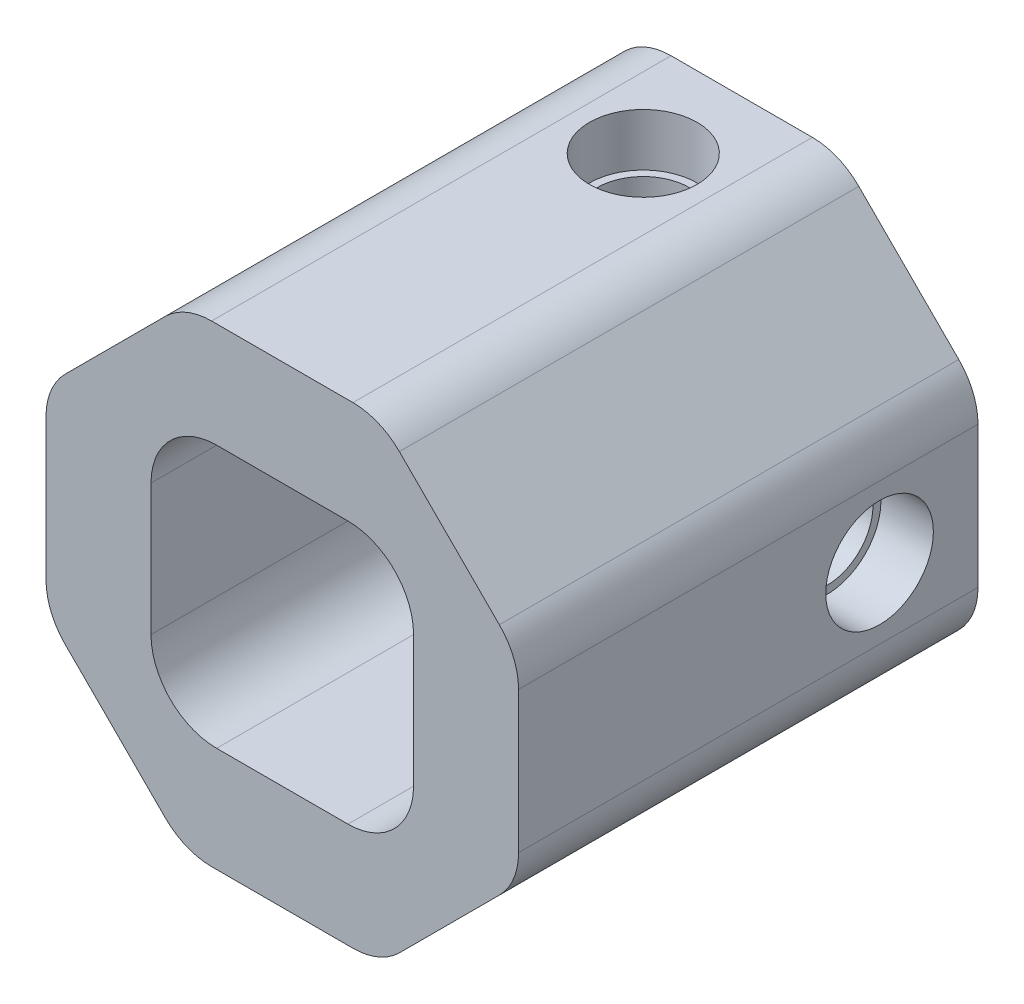
ISO-10303-21;
HEADER;
FILE_DESCRIPTION(('STEP AP214'),'2;1');
FILE_NAME('part.step','',(''),(''),'','','');
FILE_SCHEMA(('AUTOMOTIVE_DESIGN { 1 0 10303 214 1 1 1 1 }'));
ENDSEC;
DATA;
#1=APPLICATION_CONTEXT('core data for automotive mechanical design processes');
#2=APPLICATION_PROTOCOL_DEFINITION('international standard','automotive_design',2000,#1);
#3=PRODUCT_CONTEXT('',#1,'mechanical');
#4=PRODUCT('Part','Part','',(#3));
#5=PRODUCT_RELATED_PRODUCT_CATEGORY('part','',(#4));
#6=PRODUCT_DEFINITION_FORMATION('','',#4);
#7=PRODUCT_DEFINITION_CONTEXT('part definition',#1,'design');
#8=PRODUCT_DEFINITION('design','',#6,#7);
#9=PRODUCT_DEFINITION_SHAPE('','',#8);
#10=(LENGTH_UNIT() NAMED_UNIT(*) SI_UNIT(.MILLI.,.METRE.));
#11=(NAMED_UNIT(*) PLANE_ANGLE_UNIT() SI_UNIT($,.RADIAN.));
#12=(NAMED_UNIT(*) SI_UNIT($,.STERADIAN.) SOLID_ANGLE_UNIT());
#13=UNCERTAINTY_MEASURE_WITH_UNIT(LENGTH_MEASURE(1.E-05),#10,'distance_accuracy_value','');
#14=(GEOMETRIC_REPRESENTATION_CONTEXT(3) GLOBAL_UNCERTAINTY_ASSIGNED_CONTEXT((#13)) GLOBAL_UNIT_ASSIGNED_CONTEXT((#10,
#11,#12)) REPRESENTATION_CONTEXT('',''));
#15=CARTESIAN_POINT('',(0.,0.,0.));
#16=DIRECTION('',(0.,0.,1.));
#17=DIRECTION('',(1.,0.,0.));
#18=AXIS2_PLACEMENT_3D('',#15,#16,#17);
#19=CARTESIAN_POINT('',(-7.45584412271571,18.,7.5));
#20=DIRECTION('',(0.707106781186548,-0.707106781186547,0.));
#21=DIRECTION('',(0.707106781186547,0.707106781186548,0.));
#22=AXIS2_PLACEMENT_3D('',#19,#20,#21);
#23=PLANE('',#22);
#24=DIRECTION('',(-0.707106781186547,-0.707106781186548,0.));
#25=VECTOR('',#24,1.);
#26=CARTESIAN_POINT('',(-7.45584412271571,18.,-7.5));
#27=LINE('',#26,#25);
#28=CARTESIAN_POINT('',(-8.92031021678297,16.5355339059327,-7.5));
#29=VERTEX_POINT('',#28);
#30=CARTESIAN_POINT('',(-16.5355339059327,8.92031021678298,-7.5));
#31=VERTEX_POINT('',#30);
#32=EDGE_CURVE('E316',#29,#31,#27,.T.);
#33=ORIENTED_EDGE('',*,*,#32,.T.);
#34=DIRECTION('',(0.,0.,-1.));
#35=VECTOR('',#34,1.);
#36=CARTESIAN_POINT('',(-16.5355339059327,8.92031021678298,7.5));
#37=LINE('',#36,#35);
#38=CARTESIAN_POINT('',(-16.5355339059327,8.92031021678298,27.5));
#39=VERTEX_POINT('',#38);
#40=EDGE_CURVE('E11',#31,#39,#37,.F.);
#41=ORIENTED_EDGE('',*,*,#40,.T.);
#42=DIRECTION('',(-0.707106781186547,-0.707106781186548,0.));
#43=VECTOR('',#42,1.);
#44=CARTESIAN_POINT('',(-8.92031021678297,16.5355339059327,27.5));
#45=LINE('',#44,#43);
#46=CARTESIAN_POINT('',(-8.92031021678297,16.5355339059327,27.5));
#47=VERTEX_POINT('',#46);
#48=EDGE_CURVE('E273',#47,#39,#45,.T.);
#49=ORIENTED_EDGE('',*,*,#48,.F.);
#50=DIRECTION('',(0.,0.,-1.));
#51=VECTOR('',#50,1.);
#52=CARTESIAN_POINT('',(-8.92031021678297,16.5355339059327,7.5));
#53=LINE('',#52,#51);
#54=EDGE_CURVE('E47',#47,#29,#53,.T.);
#55=ORIENTED_EDGE('',*,*,#54,.T.);
#56=EDGE_LOOP('',(#33,#41,#49,#55));
#57=FACE_BOUND('',#56,.T.);
#58=ADVANCED_FACE('F39',(#57),#23,.F.);
#59=CARTESIAN_POINT('',(-18.,7.45584412271571,7.5));
#60=DIRECTION('',(1.,0.,0.));
#61=DIRECTION('',(0.,0.,-1.));
#62=AXIS2_PLACEMENT_3D('',#59,#60,#61);
#63=PLANE('',#62);
#64=CARTESIAN_POINT('',(-18.,0.,0.));
#65=DIRECTION('',(1.,0.,0.));
#66=DIRECTION('',(0.,0.,-1.));
#67=AXIS2_PLACEMENT_3D('',#64,#65,#66);
#68=CIRCLE('',#67,4.1);
#69=CARTESIAN_POINT('',(-18.,0.,-4.1));
#70=VERTEX_POINT('',#69);
#71=EDGE_CURVE('E294',#70,#70,#68,.T.);
#72=ORIENTED_EDGE('',*,*,#71,.T.);
#73=EDGE_LOOP('',(#72));
#74=FACE_BOUND('',#73,.T.);
#75=DIRECTION('',(0.,-1.,0.));
#76=VECTOR('',#75,1.);
#77=CARTESIAN_POINT('',(-18.,7.45584412271571,-7.5));
#78=LINE('',#77,#76);
#79=CARTESIAN_POINT('',(-18.,5.38477631085024,-7.5));
#80=VERTEX_POINT('',#79);
#81=CARTESIAN_POINT('',(-18.,-5.38477631085024,-7.5));
#82=VERTEX_POINT('',#81);
#83=EDGE_CURVE('E319',#80,#82,#78,.T.);
#84=ORIENTED_EDGE('',*,*,#83,.T.);
#85=DIRECTION('',(0.,0.,-1.));
#86=VECTOR('',#85,1.);
#87=CARTESIAN_POINT('',(-18.,-5.38477631085024,7.5));
#88=LINE('',#87,#86);
#89=CARTESIAN_POINT('',(-18.,-5.38477631085024,27.5));
#90=VERTEX_POINT('',#89);
#91=EDGE_CURVE('E394',#82,#90,#88,.F.);
#92=ORIENTED_EDGE('',*,*,#91,.T.);
#93=DIRECTION('',(0.,-1.,0.));
#94=VECTOR('',#93,1.);
#95=CARTESIAN_POINT('',(-18.,5.38477631085024,27.5));
#96=LINE('',#95,#94);
#97=CARTESIAN_POINT('',(-18.,5.38477631085024,27.5));
#98=VERTEX_POINT('',#97);
#99=EDGE_CURVE('E279',#98,#90,#96,.T.);
#100=ORIENTED_EDGE('',*,*,#99,.F.);
#101=DIRECTION('',(0.,0.,-1.));
#102=VECTOR('',#101,1.);
#103=CARTESIAN_POINT('',(-18.,5.38477631085024,7.5));
#104=LINE('',#103,#102);
#105=EDGE_CURVE('E392',#98,#80,#104,.T.);
#106=ORIENTED_EDGE('',*,*,#105,.T.);
#107=EDGE_LOOP('',(#84,#92,#100,#106));
#108=FACE_BOUND('',#107,.T.);
#109=ADVANCED_FACE('F416',(#74,#108),#63,.F.);
#110=CARTESIAN_POINT('',(-18.,-7.45584412271571,7.5));
#111=DIRECTION('',(0.707106781186548,0.707106781186547,0.));
#112=DIRECTION('',(-0.707106781186547,0.707106781186548,0.));
#113=AXIS2_PLACEMENT_3D('',#110,#111,#112);
#114=PLANE('',#113);
#115=DIRECTION('',(0.707106781186547,-0.707106781186548,0.));
#116=VECTOR('',#115,1.);
#117=CARTESIAN_POINT('',(-18.,-7.45584412271571,-7.5));
#118=LINE('',#117,#116);
#119=CARTESIAN_POINT('',(-16.5355339059327,-8.92031021678297,-7.5));
#120=VERTEX_POINT('',#119);
#121=CARTESIAN_POINT('',(-8.92031021678298,-16.5355339059327,-7.5));
#122=VERTEX_POINT('',#121);
#123=EDGE_CURVE('E321',#120,#122,#118,.T.);
#124=ORIENTED_EDGE('',*,*,#123,.T.);
#125=DIRECTION('',(0.,0.,-1.));
#126=VECTOR('',#125,1.);
#127=CARTESIAN_POINT('',(-8.92031021678298,-16.5355339059327,7.5));
#128=LINE('',#127,#126);
#129=CARTESIAN_POINT('',(-8.92031021678298,-16.5355339059327,27.5));
#130=VERTEX_POINT('',#129);
#131=EDGE_CURVE('E390',#122,#130,#128,.F.);
#132=ORIENTED_EDGE('',*,*,#131,.T.);
#133=DIRECTION('',(0.707106781186547,-0.707106781186548,0.));
#134=VECTOR('',#133,1.);
#135=CARTESIAN_POINT('',(-16.5355339059327,-8.92031021678297,27.5));
#136=LINE('',#135,#134);
#137=CARTESIAN_POINT('',(-16.5355339059327,-8.92031021678297,27.5));
#138=VERTEX_POINT('',#137);
#139=EDGE_CURVE('E285',#138,#130,#136,.T.);
#140=ORIENTED_EDGE('',*,*,#139,.F.);
#141=DIRECTION('',(0.,0.,-1.));
#142=VECTOR('',#141,1.);
#143=CARTESIAN_POINT('',(-16.5355339059327,-8.92031021678297,7.5));
#144=LINE('',#143,#142);
#145=EDGE_CURVE('E387',#138,#120,#144,.T.);
#146=ORIENTED_EDGE('',*,*,#145,.T.);
#147=EDGE_LOOP('',(#124,#132,#140,#146));
#148=FACE_BOUND('',#147,.T.);
#149=ADVANCED_FACE('F425',(#148),#114,.F.);
#150=CARTESIAN_POINT('',(-7.45584412271572,-18.,7.5));
#151=DIRECTION('',(0.,1.,0.));
#152=DIRECTION('',(-1.,0.,0.));
#153=AXIS2_PLACEMENT_3D('',#150,#151,#152);
#154=PLANE('',#153);
#155=CARTESIAN_POINT('',(0.,-18.,0.));
#156=DIRECTION('',(0.,1.,0.));
#157=DIRECTION('',(-1.,0.,0.));
#158=AXIS2_PLACEMENT_3D('',#155,#156,#157);
#159=CIRCLE('',#158,4.1);
#160=CARTESIAN_POINT('',(-4.1,-18.,0.));
#161=VERTEX_POINT('',#160);
#162=EDGE_CURVE('E303',#161,#161,#159,.T.);
#163=ORIENTED_EDGE('',*,*,#162,.T.);
#164=EDGE_LOOP('',(#163));
#165=FACE_BOUND('',#164,.T.);
#166=DIRECTION('',(1.,0.,0.));
#167=VECTOR('',#166,1.);
#168=CARTESIAN_POINT('',(-7.45584412271572,-18.,-7.5));
#169=LINE('',#168,#167);
#170=CARTESIAN_POINT('',(-5.38477631085024,-18.,-7.5));
#171=VERTEX_POINT('',#170);
#172=CARTESIAN_POINT('',(5.38477631085023,-18.,-7.5));
#173=VERTEX_POINT('',#172);
#174=EDGE_CURVE('E324',#171,#173,#169,.T.);
#175=ORIENTED_EDGE('',*,*,#174,.T.);
#176=DIRECTION('',(0.,0.,-1.));
#177=VECTOR('',#176,1.);
#178=CARTESIAN_POINT('',(5.38477631085023,-18.,7.5));
#179=LINE('',#178,#177);
#180=CARTESIAN_POINT('',(5.38477631085023,-18.,27.5));
#181=VERTEX_POINT('',#180);
#182=EDGE_CURVE('E385',#173,#181,#179,.F.);
#183=ORIENTED_EDGE('',*,*,#182,.T.);
#184=DIRECTION('',(1.,0.,0.));
#185=VECTOR('',#184,1.);
#186=CARTESIAN_POINT('',(-5.38477631085024,-18.,27.5));
#187=LINE('',#186,#185);
#188=CARTESIAN_POINT('',(-5.38477631085024,-18.,27.5));
#189=VERTEX_POINT('',#188);
#190=EDGE_CURVE('E291',#189,#181,#187,.T.);
#191=ORIENTED_EDGE('',*,*,#190,.F.);
#192=DIRECTION('',(0.,0.,-1.));
#193=VECTOR('',#192,1.);
#194=CARTESIAN_POINT('',(-5.38477631085024,-18.,7.5));
#195=LINE('',#194,#193);
#196=EDGE_CURVE('E382',#189,#171,#195,.T.);
#197=ORIENTED_EDGE('',*,*,#196,.T.);
#198=EDGE_LOOP('',(#175,#183,#191,#197));
#199=FACE_BOUND('',#198,.T.);
#200=ADVANCED_FACE('F432',(#165,#199),#154,.F.);
#201=CARTESIAN_POINT('',(7.45584412271571,-18.,7.5));
#202=DIRECTION('',(-0.707106781186547,0.707106781186548,0.));
#203=DIRECTION('',(-0.707106781186548,-0.707106781186547,0.));
#204=AXIS2_PLACEMENT_3D('',#201,#202,#203);
#205=PLANE('',#204);
#206=DIRECTION('',(0.707106781186548,0.707106781186547,0.));
#207=VECTOR('',#206,1.);
#208=CARTESIAN_POINT('',(7.45584412271571,-18.,-7.5));
#209=LINE('',#208,#207);
#210=CARTESIAN_POINT('',(8.92031021678297,-16.5355339059327,-7.5));
#211=VERTEX_POINT('',#210);
#212=CARTESIAN_POINT('',(16.5355339059327,-8.92031021678298,-7.5));
#213=VERTEX_POINT('',#212);
#214=EDGE_CURVE('E327',#211,#213,#209,.T.);
#215=ORIENTED_EDGE('',*,*,#214,.T.);
#216=DIRECTION('',(0.,0.,-1.));
#217=VECTOR('',#216,1.);
#218=CARTESIAN_POINT('',(16.5355339059327,-8.92031021678298,7.5));
#219=LINE('',#218,#217);
#220=CARTESIAN_POINT('',(16.5355339059327,-8.92031021678298,27.5));
#221=VERTEX_POINT('',#220);
#222=EDGE_CURVE('E380',#213,#221,#219,.F.);
#223=ORIENTED_EDGE('',*,*,#222,.T.);
#224=DIRECTION('',(0.707106781186548,0.707106781186547,0.));
#225=VECTOR('',#224,1.);
#226=CARTESIAN_POINT('',(8.92031021678297,-16.5355339059327,27.5));
#227=LINE('',#226,#225);
#228=CARTESIAN_POINT('',(8.92031021678297,-16.5355339059327,27.5));
#229=VERTEX_POINT('',#228);
#230=EDGE_CURVE('E249',#229,#221,#227,.T.);
#231=ORIENTED_EDGE('',*,*,#230,.F.);
#232=DIRECTION('',(0.,0.,-1.));
#233=VECTOR('',#232,1.);
#234=CARTESIAN_POINT('',(8.92031021678297,-16.5355339059327,7.5));
#235=LINE('',#234,#233);
#236=EDGE_CURVE('E377',#229,#211,#235,.T.);
#237=ORIENTED_EDGE('',*,*,#236,.T.);
#238=EDGE_LOOP('',(#215,#223,#231,#237));
#239=FACE_BOUND('',#238,.T.);
#240=ADVANCED_FACE('F833',(#239),#205,.F.);
#241=CARTESIAN_POINT('',(18.,-7.45584412271571,7.5));
#242=DIRECTION('',(-1.,0.,0.));
#243=DIRECTION('',(0.,-1.,0.));
#244=AXIS2_PLACEMENT_3D('',#241,#242,#243);
#245=PLANE('',#244);
#246=CARTESIAN_POINT('',(18.,0.,0.));
#247=DIRECTION('',(-1.,0.,0.));
#248=DIRECTION('',(0.,-1.,0.));
#249=AXIS2_PLACEMENT_3D('',#246,#247,#248);
#250=CIRCLE('',#249,4.1);
#251=CARTESIAN_POINT('',(18.,-4.1,0.));
#252=VERTEX_POINT('',#251);
#253=EDGE_CURVE('E297',#252,#252,#250,.T.);
#254=ORIENTED_EDGE('',*,*,#253,.T.);
#255=EDGE_LOOP('',(#254));
#256=FACE_BOUND('',#255,.T.);
#257=DIRECTION('',(0.,0.,-1.));
#258=VECTOR('',#257,1.);
#259=CARTESIAN_POINT('',(18.,5.38477631085023,7.5));
#260=LINE('',#259,#258);
#261=CARTESIAN_POINT('',(18.,5.38477631085023,-7.5));
#262=VERTEX_POINT('',#261);
#263=CARTESIAN_POINT('',(18.,5.38477631085023,27.5));
#264=VERTEX_POINT('',#263);
#265=EDGE_CURVE('E358',#262,#264,#260,.F.);
#266=ORIENTED_EDGE('',*,*,#265,.T.);
#267=DIRECTION('',(0.,1.,0.));
#268=VECTOR('',#267,1.);
#269=CARTESIAN_POINT('',(18.,-5.38477631085024,27.5));
#270=LINE('',#269,#268);
#271=CARTESIAN_POINT('',(18.,-5.38477631085024,27.5));
#272=VERTEX_POINT('',#271);
#273=EDGE_CURVE('E255',#272,#264,#270,.T.);
#274=ORIENTED_EDGE('',*,*,#273,.F.);
#275=DIRECTION('',(0.,0.,-1.));
#276=VECTOR('',#275,1.);
#277=CARTESIAN_POINT('',(18.,-5.38477631085024,7.5));
#278=LINE('',#277,#276);
#279=CARTESIAN_POINT('',(18.,-5.38477631085024,-7.5));
#280=VERTEX_POINT('',#279);
#281=EDGE_CURVE('E360',#272,#280,#278,.T.);
#282=ORIENTED_EDGE('',*,*,#281,.T.);
#283=DIRECTION('',(0.,1.,0.));
#284=VECTOR('',#283,1.);
#285=CARTESIAN_POINT('',(18.,-7.45584412271571,-7.5));
#286=LINE('',#285,#284);
#287=EDGE_CURVE('E330',#280,#262,#286,.T.);
#288=ORIENTED_EDGE('',*,*,#287,.T.);
#289=EDGE_LOOP('',(#266,#274,#282,#288));
#290=FACE_BOUND('',#289,.T.);
#291=ADVANCED_FACE('F445',(#256,#290),#245,.F.);
#292=CARTESIAN_POINT('',(18.,7.45584412271571,7.5));
#293=DIRECTION('',(-0.707106781186548,-0.707106781186547,0.));
#294=DIRECTION('',(0.707106781186547,-0.707106781186548,0.));
#295=AXIS2_PLACEMENT_3D('',#292,#293,#294);
#296=PLANE('',#295);
#297=DIRECTION('',(0.,0.,-1.));
#298=VECTOR('',#297,1.);
#299=CARTESIAN_POINT('',(8.92031021678298,16.5355339059327,7.5));
#300=LINE('',#299,#298);
#301=CARTESIAN_POINT('',(8.92031021678298,16.5355339059327,-7.5));
#302=VERTEX_POINT('',#301);
#303=CARTESIAN_POINT('',(8.92031021678298,16.5355339059327,27.5));
#304=VERTEX_POINT('',#303);
#305=EDGE_CURVE('E396',#302,#304,#300,.F.);
#306=ORIENTED_EDGE('',*,*,#305,.T.);
#307=DIRECTION('',(-0.707106781186547,0.707106781186548,0.));
#308=VECTOR('',#307,1.);
#309=CARTESIAN_POINT('',(16.5355339059327,8.92031021678297,27.5));
#310=LINE('',#309,#308);
#311=CARTESIAN_POINT('',(16.5355339059327,8.92031021678297,27.5));
#312=VERTEX_POINT('',#311);
#313=EDGE_CURVE('E261',#312,#304,#310,.T.);
#314=ORIENTED_EDGE('',*,*,#313,.F.);
#315=DIRECTION('',(0.,0.,-1.));
#316=VECTOR('',#315,1.);
#317=CARTESIAN_POINT('',(16.5355339059327,8.92031021678297,7.5));
#318=LINE('',#317,#316);
#319=CARTESIAN_POINT('',(16.5355339059327,8.92031021678297,-7.5));
#320=VERTEX_POINT('',#319);
#321=EDGE_CURVE('E398',#312,#320,#318,.T.);
#322=ORIENTED_EDGE('',*,*,#321,.T.);
#323=DIRECTION('',(-0.707106781186547,0.707106781186548,0.));
#324=VECTOR('',#323,1.);
#325=CARTESIAN_POINT('',(18.,7.45584412271571,-7.5));
#326=LINE('',#325,#324);
#327=EDGE_CURVE('E333',#320,#302,#326,.T.);
#328=ORIENTED_EDGE('',*,*,#327,.T.);
#329=EDGE_LOOP('',(#306,#314,#322,#328));
#330=FACE_BOUND('',#329,.T.);
#331=ADVANCED_FACE('F454',(#330),#296,.F.);
#332=CARTESIAN_POINT('',(7.45584412271571,18.,7.5));
#333=DIRECTION('',(0.,-1.,0.));
#334=DIRECTION('',(1.,0.,0.));
#335=AXIS2_PLACEMENT_3D('',#332,#333,#334);
#336=PLANE('',#335);
#337=CARTESIAN_POINT('',(0.,18.,0.));
#338=DIRECTION('',(0.,-1.,0.));
#339=DIRECTION('',(0.,0.,-1.));
#340=AXIS2_PLACEMENT_3D('',#337,#338,#339);
#341=CIRCLE('',#340,4.1);
#342=CARTESIAN_POINT('',(0.,18.,-4.1));
#343=VERTEX_POINT('',#342);
#344=EDGE_CURVE('E300',#343,#343,#341,.T.);
#345=ORIENTED_EDGE('',*,*,#344,.T.);
#346=EDGE_LOOP('',(#345));
#347=FACE_BOUND('',#346,.T.);
#348=DIRECTION('',(0.,0.,-1.));
#349=VECTOR('',#348,1.);
#350=CARTESIAN_POINT('',(-5.38477631085023,18.,7.5));
#351=LINE('',#350,#349);
#352=CARTESIAN_POINT('',(-5.38477631085023,18.,-7.5));
#353=VERTEX_POINT('',#352);
#354=CARTESIAN_POINT('',(-5.38477631085023,18.,27.5));
#355=VERTEX_POINT('',#354);
#356=EDGE_CURVE('E401',#353,#355,#351,.F.);
#357=ORIENTED_EDGE('',*,*,#356,.T.);
#358=DIRECTION('',(-1.,0.,0.));
#359=VECTOR('',#358,1.);
#360=CARTESIAN_POINT('',(5.38477631085024,18.,27.5));
#361=LINE('',#360,#359);
#362=CARTESIAN_POINT('',(5.38477631085024,18.,27.5));
#363=VERTEX_POINT('',#362);
#364=EDGE_CURVE('E267',#363,#355,#361,.T.);
#365=ORIENTED_EDGE('',*,*,#364,.F.);
#366=DIRECTION('',(0.,0.,-1.));
#367=VECTOR('',#366,1.);
#368=CARTESIAN_POINT('',(5.38477631085024,18.,7.5));
#369=LINE('',#368,#367);
#370=CARTESIAN_POINT('',(5.38477631085024,18.,-7.5));
#371=VERTEX_POINT('',#370);
#372=EDGE_CURVE('E403',#363,#371,#369,.T.);
#373=ORIENTED_EDGE('',*,*,#372,.T.);
#374=DIRECTION('',(-1.,0.,0.));
#375=VECTOR('',#374,1.);
#376=CARTESIAN_POINT('',(7.45584412271571,18.,-7.5));
#377=LINE('',#376,#375);
#378=EDGE_CURVE('E336',#371,#353,#377,.T.);
#379=ORIENTED_EDGE('',*,*,#378,.T.);
#380=EDGE_LOOP('',(#357,#365,#373,#379));
#381=FACE_BOUND('',#380,.T.);
#382=ADVANCED_FACE('F461',(#347,#381),#336,.F.);
#383=CARTESIAN_POINT('',(0.,0.,-7.5));
#384=DIRECTION('',(0.,0.,1.));
#385=DIRECTION('',(1.,0.,0.));
#386=AXIS2_PLACEMENT_3D('',#383,#384,#385);
#387=PLANE('',#386);
#388=DIRECTION('',(0.,1.,0.));
#389=VECTOR('',#388,1.);
#390=CARTESIAN_POINT('',(10.,-10.,-7.5));
#391=LINE('',#390,#389);
#392=CARTESIAN_POINT('',(10.,-5.,-7.5));
#393=VERTEX_POINT('',#392);
#394=CARTESIAN_POINT('',(10.,5.,-7.5));
#395=VERTEX_POINT('',#394);
#396=EDGE_CURVE('E310',#393,#395,#391,.T.);
#397=ORIENTED_EDGE('',*,*,#396,.T.);
#398=CARTESIAN_POINT('',(5.,5.,-7.5));
#399=DIRECTION('',(0.,0.,1.));
#400=DIRECTION('',(1.,0.,0.));
#401=AXIS2_PLACEMENT_3D('',#398,#399,#400);
#402=CIRCLE('',#401,5.);
#403=CARTESIAN_POINT('',(5.,10.,-7.5));
#404=VERTEX_POINT('',#403);
#405=EDGE_CURVE('E354',#395,#404,#402,.T.);
#406=ORIENTED_EDGE('',*,*,#405,.T.);
#407=DIRECTION('',(-1.,0.,0.));
#408=VECTOR('',#407,1.);
#409=CARTESIAN_POINT('',(10.,10.,-7.5));
#410=LINE('',#409,#408);
#411=CARTESIAN_POINT('',(-5.,10.,-7.5));
#412=VERTEX_POINT('',#411);
#413=EDGE_CURVE('E313',#404,#412,#410,.T.);
#414=ORIENTED_EDGE('',*,*,#413,.T.);
#415=CARTESIAN_POINT('',(-5.,5.,-7.5));
#416=DIRECTION('',(0.,0.,1.));
#417=DIRECTION('',(1.,0.,0.));
#418=AXIS2_PLACEMENT_3D('',#415,#416,#417);
#419=CIRCLE('',#418,5.);
#420=CARTESIAN_POINT('',(-10.,5.,-7.5));
#421=VERTEX_POINT('',#420);
#422=EDGE_CURVE('E356',#412,#421,#419,.T.);
#423=ORIENTED_EDGE('',*,*,#422,.T.);
#424=DIRECTION('',(0.,-1.,0.));
#425=VECTOR('',#424,1.);
#426=CARTESIAN_POINT('',(-10.,-10.,-7.5));
#427=LINE('',#426,#425);
#428=CARTESIAN_POINT('',(-10.,-5.,-7.5));
#429=VERTEX_POINT('',#428);
#430=EDGE_CURVE('E209',#421,#429,#427,.T.);
#431=ORIENTED_EDGE('',*,*,#430,.T.);
#432=CARTESIAN_POINT('',(-5.,-5.,-7.5));
#433=DIRECTION('',(0.,0.,1.));
#434=DIRECTION('',(1.,0.,0.));
#435=AXIS2_PLACEMENT_3D('',#432,#433,#434);
#436=CIRCLE('',#435,5.);
#437=CARTESIAN_POINT('',(-5.,-10.,-7.5));
#438=VERTEX_POINT('',#437);
#439=EDGE_CURVE('E352',#429,#438,#436,.T.);
#440=ORIENTED_EDGE('',*,*,#439,.T.);
#441=DIRECTION('',(1.,0.,0.));
#442=VECTOR('',#441,1.);
#443=CARTESIAN_POINT('',(10.,-10.,-7.5));
#444=LINE('',#443,#442);
#445=CARTESIAN_POINT('',(5.,-10.,-7.5));
#446=VERTEX_POINT('',#445);
#447=EDGE_CURVE('E307',#438,#446,#444,.T.);
#448=ORIENTED_EDGE('',*,*,#447,.T.);
#449=CARTESIAN_POINT('',(5.,-5.,-7.5));
#450=DIRECTION('',(0.,0.,1.));
#451=DIRECTION('',(1.,0.,0.));
#452=AXIS2_PLACEMENT_3D('',#449,#450,#451);
#453=CIRCLE('',#452,5.);
#454=EDGE_CURVE('E350',#446,#393,#453,.T.);
#455=ORIENTED_EDGE('',*,*,#454,.T.);
#456=EDGE_LOOP('',(#397,#406,#414,#423,#431,#440,#448,#455));
#457=FACE_BOUND('',#456,.T.);
#458=ORIENTED_EDGE('',*,*,#287,.F.);
#459=CARTESIAN_POINT('',(13.,-5.38477631085024,-7.5));
#460=DIRECTION('',(0.,0.,1.));
#461=DIRECTION('',(1.,0.,0.));
#462=AXIS2_PLACEMENT_3D('',#459,#460,#461);
#463=CIRCLE('',#462,5.);
#464=EDGE_CURVE('E375',#280,#213,#463,.F.);
#465=ORIENTED_EDGE('',*,*,#464,.T.);
#466=ORIENTED_EDGE('',*,*,#214,.F.);
#467=CARTESIAN_POINT('',(5.38477631085023,-13.,-7.5));
#468=DIRECTION('',(0.,0.,1.));
#469=DIRECTION('',(1.,0.,0.));
#470=AXIS2_PLACEMENT_3D('',#467,#468,#469);
#471=CIRCLE('',#470,5.);
#472=EDGE_CURVE('E373',#211,#173,#471,.F.);
#473=ORIENTED_EDGE('',*,*,#472,.T.);
#474=ORIENTED_EDGE('',*,*,#174,.F.);
#475=CARTESIAN_POINT('',(-5.38477631085024,-13.,-7.5));
#476=DIRECTION('',(0.,0.,1.));
#477=DIRECTION('',(1.,0.,0.));
#478=AXIS2_PLACEMENT_3D('',#475,#476,#477);
#479=CIRCLE('',#478,5.);
#480=EDGE_CURVE('E371',#171,#122,#479,.F.);
#481=ORIENTED_EDGE('',*,*,#480,.T.);
#482=ORIENTED_EDGE('',*,*,#123,.F.);
#483=CARTESIAN_POINT('',(-13.,-5.38477631085024,-7.5));
#484=DIRECTION('',(0.,0.,1.));
#485=DIRECTION('',(1.,0.,0.));
#486=AXIS2_PLACEMENT_3D('',#483,#484,#485);
#487=CIRCLE('',#486,5.);
#488=EDGE_CURVE('E54',#120,#82,#487,.F.);
#489=ORIENTED_EDGE('',*,*,#488,.T.);
#490=ORIENTED_EDGE('',*,*,#83,.F.);
#491=CARTESIAN_POINT('',(-13.,5.38477631085024,-7.5));
#492=DIRECTION('',(0.,0.,1.));
#493=DIRECTION('',(1.,0.,0.));
#494=AXIS2_PLACEMENT_3D('',#491,#492,#493);
#495=CIRCLE('',#494,5.);
#496=EDGE_CURVE('E62',#80,#31,#495,.F.);
#497=ORIENTED_EDGE('',*,*,#496,.T.);
#498=ORIENTED_EDGE('',*,*,#32,.F.);
#499=CARTESIAN_POINT('',(-5.38477631085023,13.,-7.5));
#500=DIRECTION('',(0.,0.,1.));
#501=DIRECTION('',(1.,0.,0.));
#502=AXIS2_PLACEMENT_3D('',#499,#500,#501);
#503=CIRCLE('',#502,5.);
#504=EDGE_CURVE('E363',#29,#353,#503,.F.);
#505=ORIENTED_EDGE('',*,*,#504,.T.);
#506=ORIENTED_EDGE('',*,*,#378,.F.);
#507=CARTESIAN_POINT('',(5.38477631085024,13.,-7.5));
#508=DIRECTION('',(0.,0.,1.));
#509=DIRECTION('',(1.,0.,0.));
#510=AXIS2_PLACEMENT_3D('',#507,#508,#509);
#511=CIRCLE('',#510,5.);
#512=EDGE_CURVE('E366',#371,#302,#511,.F.);
#513=ORIENTED_EDGE('',*,*,#512,.T.);
#514=ORIENTED_EDGE('',*,*,#327,.F.);
#515=CARTESIAN_POINT('',(13.,5.38477631085023,-7.5));
#516=DIRECTION('',(0.,0.,1.));
#517=DIRECTION('',(1.,0.,0.));
#518=AXIS2_PLACEMENT_3D('',#515,#516,#517);
#519=CIRCLE('',#518,5.);
#520=EDGE_CURVE('E368',#320,#262,#519,.F.);
#521=ORIENTED_EDGE('',*,*,#520,.T.);
#522=EDGE_LOOP('',(#458,#465,#466,#473,#474,#481,#482,#489,#490,#497,#498,#505,#506,#513,#514,#521));
#523=FACE_BOUND('',#522,.T.);
#524=ADVANCED_FACE('F412',(#457,#523),#387,.F.);
#525=CARTESIAN_POINT('',(-10.,-10.,-7.5));
#526=DIRECTION('',(-1.,0.,0.));
#527=DIRECTION('',(0.,0.,1.));
#528=AXIS2_PLACEMENT_3D('',#525,#526,#527);
#529=PLANE('',#528);
#530=DIRECTION('',(0.,0.,1.));
#531=VECTOR('',#530,1.);
#532=CARTESIAN_POINT('',(-10.,5.,7.5));
#533=LINE('',#532,#531);
#534=CARTESIAN_POINT('',(-10.,5.,27.5));
#535=VERTEX_POINT('',#534);
#536=EDGE_CURVE('E201',#421,#535,#533,.T.);
#537=ORIENTED_EDGE('',*,*,#536,.T.);
#538=DIRECTION('',(0.,-1.,0.));
#539=VECTOR('',#538,1.);
#540=CARTESIAN_POINT('',(-10.,5.,27.5));
#541=LINE('',#540,#539);
#542=CARTESIAN_POINT('',(-10.,-5.,27.5));
#543=VERTEX_POINT('',#542);
#544=EDGE_CURVE('E206',#535,#543,#541,.T.);
#545=ORIENTED_EDGE('',*,*,#544,.T.);
#546=DIRECTION('',(0.,0.,1.));
#547=VECTOR('',#546,1.);
#548=CARTESIAN_POINT('',(-10.,-5.,-7.5));
#549=LINE('',#548,#547);
#550=EDGE_CURVE('E212',#543,#429,#549,.F.);
#551=ORIENTED_EDGE('',*,*,#550,.T.);
#552=ORIENTED_EDGE('',*,*,#430,.F.);
#553=EDGE_LOOP('',(#537,#545,#551,#552));
#554=FACE_BOUND('',#553,.T.);
#555=CARTESIAN_POINT('',(-10.,0.,0.));
#556=DIRECTION('',(-1.,0.,0.));
#557=DIRECTION('',(0.,0.,1.));
#558=AXIS2_PLACEMENT_3D('',#555,#556,#557);
#559=CIRCLE('',#558,3.5);
#560=CARTESIAN_POINT('',(-10.,0.,3.5));
#561=VERTEX_POINT('',#560);
#562=EDGE_CURVE('E1019',#561,#561,#559,.F.);
#563=ORIENTED_EDGE('',*,*,#562,.F.);
#564=EDGE_LOOP('',(#563));
#565=FACE_BOUND('',#564,.T.);
#566=ADVANCED_FACE('F203',(#554,#565),#529,.F.);
#567=CARTESIAN_POINT('',(10.,10.,-7.5));
#568=DIRECTION('',(0.,1.,0.));
#569=DIRECTION('',(0.,0.,1.));
#570=AXIS2_PLACEMENT_3D('',#567,#568,#569);
#571=PLANE('',#570);
#572=ORIENTED_EDGE('',*,*,#413,.F.);
#573=DIRECTION('',(0.,0.,1.));
#574=VECTOR('',#573,1.);
#575=CARTESIAN_POINT('',(5.,10.,7.5));
#576=LINE('',#575,#574);
#577=CARTESIAN_POINT('',(5.,10.,27.5));
#578=VERTEX_POINT('',#577);
#579=EDGE_CURVE('E348',#404,#578,#576,.T.);
#580=ORIENTED_EDGE('',*,*,#579,.T.);
#581=DIRECTION('',(-1.,0.,0.));
#582=VECTOR('',#581,1.);
#583=CARTESIAN_POINT('',(5.,10.,27.5));
#584=LINE('',#583,#582);
#585=CARTESIAN_POINT('',(-5.,10.,27.5));
#586=VERTEX_POINT('',#585);
#587=EDGE_CURVE('E244',#578,#586,#584,.T.);
#588=ORIENTED_EDGE('',*,*,#587,.T.);
#589=DIRECTION('',(0.,0.,1.));
#590=VECTOR('',#589,1.);
#591=CARTESIAN_POINT('',(-5.,10.,-7.5));
#592=LINE('',#591,#590);
#593=EDGE_CURVE('E218',#586,#412,#592,.F.);
#594=ORIENTED_EDGE('',*,*,#593,.T.);
#595=EDGE_LOOP('',(#572,#580,#588,#594));
#596=FACE_BOUND('',#595,.T.);
#597=CARTESIAN_POINT('',(0.,10.,0.));
#598=DIRECTION('',(0.,1.,0.));
#599=DIRECTION('',(0.,0.,1.));
#600=AXIS2_PLACEMENT_3D('',#597,#598,#599);
#601=CIRCLE('',#600,3.5);
#602=CARTESIAN_POINT('',(0.,10.,3.5));
#603=VERTEX_POINT('',#602);
#604=EDGE_CURVE('E1010',#603,#603,#601,.F.);
#605=ORIENTED_EDGE('',*,*,#604,.F.);
#606=EDGE_LOOP('',(#605));
#607=FACE_BOUND('',#606,.T.);
#608=ADVANCED_FACE('F586',(#596,#607),#571,.F.);
#609=CARTESIAN_POINT('',(10.,-10.,-7.5));
#610=DIRECTION('',(1.,0.,0.));
#611=DIRECTION('',(0.,0.,-1.));
#612=AXIS2_PLACEMENT_3D('',#609,#610,#611);
#613=PLANE('',#612);
#614=ORIENTED_EDGE('',*,*,#396,.F.);
#615=DIRECTION('',(0.,0.,1.));
#616=VECTOR('',#615,1.);
#617=CARTESIAN_POINT('',(10.,-5.,7.5));
#618=LINE('',#617,#616);
#619=CARTESIAN_POINT('',(10.,-5.,27.5));
#620=VERTEX_POINT('',#619);
#621=EDGE_CURVE('E341',#393,#620,#618,.T.);
#622=ORIENTED_EDGE('',*,*,#621,.T.);
#623=DIRECTION('',(0.,1.,0.));
#624=VECTOR('',#623,1.);
#625=CARTESIAN_POINT('',(10.,-5.,27.5));
#626=LINE('',#625,#624);
#627=CARTESIAN_POINT('',(10.,5.,27.5));
#628=VERTEX_POINT('',#627);
#629=EDGE_CURVE('E238',#620,#628,#626,.T.);
#630=ORIENTED_EDGE('',*,*,#629,.T.);
#631=DIRECTION('',(0.,0.,1.));
#632=VECTOR('',#631,1.);
#633=CARTESIAN_POINT('',(10.,5.,-7.5));
#634=LINE('',#633,#632);
#635=EDGE_CURVE('E339',#628,#395,#634,.F.);
#636=ORIENTED_EDGE('',*,*,#635,.T.);
#637=EDGE_LOOP('',(#614,#622,#630,#636));
#638=FACE_BOUND('',#637,.T.);
#639=CARTESIAN_POINT('',(10.,0.,0.));
#640=DIRECTION('',(1.,0.,0.));
#641=DIRECTION('',(0.,0.,-1.));
#642=AXIS2_PLACEMENT_3D('',#639,#640,#641);
#643=CIRCLE('',#642,3.5);
#644=CARTESIAN_POINT('',(10.,0.,-3.5));
#645=VERTEX_POINT('',#644);
#646=EDGE_CURVE('E989',#645,#645,#643,.F.);
#647=ORIENTED_EDGE('',*,*,#646,.F.);
#648=EDGE_LOOP('',(#647));
#649=FACE_BOUND('',#648,.T.);
#650=ADVANCED_FACE('F544',(#638,#649),#613,.F.);
#651=CARTESIAN_POINT('',(10.,-10.,-7.5));
#652=DIRECTION('',(0.,-1.,0.));
#653=DIRECTION('',(0.,0.,-1.));
#654=AXIS2_PLACEMENT_3D('',#651,#652,#653);
#655=PLANE('',#654);
#656=DIRECTION('',(0.,0.,1.));
#657=VECTOR('',#656,1.);
#658=CARTESIAN_POINT('',(-5.,-10.,7.5));
#659=LINE('',#658,#657);
#660=CARTESIAN_POINT('',(-5.,-10.,27.5));
#661=VERTEX_POINT('',#660);
#662=EDGE_CURVE('E343',#438,#661,#659,.T.);
#663=ORIENTED_EDGE('',*,*,#662,.T.);
#664=DIRECTION('',(1.,0.,0.));
#665=VECTOR('',#664,1.);
#666=CARTESIAN_POINT('',(-5.,-10.,27.5));
#667=LINE('',#666,#665);
#668=CARTESIAN_POINT('',(5.,-10.,27.5));
#669=VERTEX_POINT('',#668);
#670=EDGE_CURVE('E229',#661,#669,#667,.T.);
#671=ORIENTED_EDGE('',*,*,#670,.T.);
#672=DIRECTION('',(0.,0.,1.));
#673=VECTOR('',#672,1.);
#674=CARTESIAN_POINT('',(5.,-10.,-7.5));
#675=LINE('',#674,#673);
#676=EDGE_CURVE('E213',#669,#446,#675,.F.);
#677=ORIENTED_EDGE('',*,*,#676,.T.);
#678=ORIENTED_EDGE('',*,*,#447,.F.);
#679=EDGE_LOOP('',(#663,#671,#677,#678));
#680=FACE_BOUND('',#679,.T.);
#681=CARTESIAN_POINT('',(0.,-10.,0.));
#682=DIRECTION('',(0.,-1.,0.));
#683=DIRECTION('',(0.,0.,-1.));
#684=AXIS2_PLACEMENT_3D('',#681,#682,#683);
#685=CIRCLE('',#684,3.5);
#686=CARTESIAN_POINT('',(0.,-10.,-3.5));
#687=VERTEX_POINT('',#686);
#688=EDGE_CURVE('E222',#687,#687,#685,.F.);
#689=ORIENTED_EDGE('',*,*,#688,.F.);
#690=EDGE_LOOP('',(#689));
#691=FACE_BOUND('',#690,.T.);
#692=ADVANCED_FACE('F486',(#680,#691),#655,.F.);
#693=CARTESIAN_POINT('',(5.,-5.,-7.5));
#694=DIRECTION('',(0.,0.,-1.));
#695=DIRECTION('',(-1.,0.,0.));
#696=AXIS2_PLACEMENT_3D('',#693,#694,#695);
#697=CYLINDRICAL_SURFACE('',#696,5.);
#698=ORIENTED_EDGE('',*,*,#454,.F.);
#699=ORIENTED_EDGE('',*,*,#676,.F.);
#700=CARTESIAN_POINT('',(5.,-5.,27.5));
#701=DIRECTION('',(0.,0.,1.));
#702=DIRECTION('',(1.,0.,0.));
#703=AXIS2_PLACEMENT_3D('',#700,#701,#702);
#704=CIRCLE('',#703,5.);
#705=EDGE_CURVE('E235',#669,#620,#704,.T.);
#706=ORIENTED_EDGE('',*,*,#705,.T.);
#707=ORIENTED_EDGE('',*,*,#621,.F.);
#708=EDGE_LOOP('',(#698,#699,#706,#707));
#709=FACE_BOUND('',#708,.T.);
#710=ADVANCED_FACE('F482',(#709),#697,.F.);
#711=CARTESIAN_POINT('',(-5.,-5.,-7.5));
#712=DIRECTION('',(0.,0.,-1.));
#713=DIRECTION('',(-1.,0.,0.));
#714=AXIS2_PLACEMENT_3D('',#711,#712,#713);
#715=CYLINDRICAL_SURFACE('',#714,5.);
#716=ORIENTED_EDGE('',*,*,#439,.F.);
#717=ORIENTED_EDGE('',*,*,#550,.F.);
#718=CARTESIAN_POINT('',(-5.,-5.,27.5));
#719=DIRECTION('',(0.,0.,1.));
#720=DIRECTION('',(1.,0.,0.));
#721=AXIS2_PLACEMENT_3D('',#718,#719,#720);
#722=CIRCLE('',#721,5.);
#723=EDGE_CURVE('E227',#543,#661,#722,.T.);
#724=ORIENTED_EDGE('',*,*,#723,.T.);
#725=ORIENTED_EDGE('',*,*,#662,.F.);
#726=EDGE_LOOP('',(#716,#717,#724,#725));
#727=FACE_BOUND('',#726,.T.);
#728=ADVANCED_FACE('F485',(#727),#715,.F.);
#729=CARTESIAN_POINT('',(5.,5.,-7.5));
#730=DIRECTION('',(0.,0.,-1.));
#731=DIRECTION('',(-1.,0.,0.));
#732=AXIS2_PLACEMENT_3D('',#729,#730,#731);
#733=CYLINDRICAL_SURFACE('',#732,5.);
#734=ORIENTED_EDGE('',*,*,#405,.F.);
#735=ORIENTED_EDGE('',*,*,#635,.F.);
#736=CARTESIAN_POINT('',(5.,5.,27.5));
#737=DIRECTION('',(0.,0.,1.));
#738=DIRECTION('',(1.,0.,0.));
#739=AXIS2_PLACEMENT_3D('',#736,#737,#738);
#740=CIRCLE('',#739,5.);
#741=EDGE_CURVE('E241',#628,#578,#740,.T.);
#742=ORIENTED_EDGE('',*,*,#741,.T.);
#743=ORIENTED_EDGE('',*,*,#579,.F.);
#744=EDGE_LOOP('',(#734,#735,#742,#743));
#745=FACE_BOUND('',#744,.T.);
#746=ADVANCED_FACE('F490',(#745),#733,.F.);
#747=CARTESIAN_POINT('',(-5.,5.,-7.5));
#748=DIRECTION('',(0.,0.,-1.));
#749=DIRECTION('',(-1.,0.,0.));
#750=AXIS2_PLACEMENT_3D('',#747,#748,#749);
#751=CYLINDRICAL_SURFACE('',#750,5.);
#752=ORIENTED_EDGE('',*,*,#422,.F.);
#753=ORIENTED_EDGE('',*,*,#593,.F.);
#754=CARTESIAN_POINT('',(-5.,5.,27.5));
#755=DIRECTION('',(0.,0.,1.));
#756=DIRECTION('',(1.,0.,0.));
#757=AXIS2_PLACEMENT_3D('',#754,#755,#756);
#758=CIRCLE('',#757,5.);
#759=EDGE_CURVE('E216',#586,#535,#758,.T.);
#760=ORIENTED_EDGE('',*,*,#759,.T.);
#761=ORIENTED_EDGE('',*,*,#536,.F.);
#762=EDGE_LOOP('',(#752,#753,#760,#761));
#763=FACE_BOUND('',#762,.T.);
#764=ADVANCED_FACE('F217',(#763),#751,.F.);
#765=CARTESIAN_POINT('',(13.,-5.38477631085024,7.5));
#766=DIRECTION('',(0.,0.,-1.));
#767=DIRECTION('',(-1.,0.,0.));
#768=AXIS2_PLACEMENT_3D('',#765,#766,#767);
#769=CYLINDRICAL_SURFACE('',#768,5.);
#770=ORIENTED_EDGE('',*,*,#281,.F.);
#771=CARTESIAN_POINT('',(13.,-5.38477631085024,27.5));
#772=DIRECTION('',(0.,0.,1.));
#773=DIRECTION('',(1.,0.,0.));
#774=AXIS2_PLACEMENT_3D('',#771,#772,#773);
#775=CIRCLE('',#774,5.);
#776=EDGE_CURVE('E252',#221,#272,#775,.T.);
#777=ORIENTED_EDGE('',*,*,#776,.F.);
#778=ORIENTED_EDGE('',*,*,#222,.F.);
#779=ORIENTED_EDGE('',*,*,#464,.F.);
#780=EDGE_LOOP('',(#770,#777,#778,#779));
#781=FACE_BOUND('',#780,.T.);
#782=ADVANCED_FACE('F443',(#781),#769,.T.);
#783=CARTESIAN_POINT('',(5.38477631085023,-13.,7.5));
#784=DIRECTION('',(0.,0.,-1.));
#785=DIRECTION('',(-1.,0.,0.));
#786=AXIS2_PLACEMENT_3D('',#783,#784,#785);
#787=CYLINDRICAL_SURFACE('',#786,5.);
#788=ORIENTED_EDGE('',*,*,#236,.F.);
#789=CARTESIAN_POINT('',(5.38477631085023,-13.,27.5));
#790=DIRECTION('',(0.,0.,1.));
#791=DIRECTION('',(1.,0.,0.));
#792=AXIS2_PLACEMENT_3D('',#789,#790,#791);
#793=CIRCLE('',#792,5.);
#794=EDGE_CURVE('E246',#181,#229,#793,.T.);
#795=ORIENTED_EDGE('',*,*,#794,.F.);
#796=ORIENTED_EDGE('',*,*,#182,.F.);
#797=ORIENTED_EDGE('',*,*,#472,.F.);
#798=EDGE_LOOP('',(#788,#795,#796,#797));
#799=FACE_BOUND('',#798,.T.);
#800=ADVANCED_FACE('F436',(#799),#787,.T.);
#801=CARTESIAN_POINT('',(-5.38477631085024,-13.,7.5));
#802=DIRECTION('',(0.,0.,-1.));
#803=DIRECTION('',(-1.,0.,0.));
#804=AXIS2_PLACEMENT_3D('',#801,#802,#803);
#805=CYLINDRICAL_SURFACE('',#804,5.);
#806=ORIENTED_EDGE('',*,*,#196,.F.);
#807=CARTESIAN_POINT('',(-5.38477631085024,-13.,27.5));
#808=DIRECTION('',(0.,0.,1.));
#809=DIRECTION('',(1.,0.,0.));
#810=AXIS2_PLACEMENT_3D('',#807,#808,#809);
#811=CIRCLE('',#810,5.);
#812=EDGE_CURVE('E288',#130,#189,#811,.T.);
#813=ORIENTED_EDGE('',*,*,#812,.F.);
#814=ORIENTED_EDGE('',*,*,#131,.F.);
#815=ORIENTED_EDGE('',*,*,#480,.F.);
#816=EDGE_LOOP('',(#806,#813,#814,#815));
#817=FACE_BOUND('',#816,.T.);
#818=ADVANCED_FACE('F428',(#817),#805,.T.);
#819=CARTESIAN_POINT('',(-13.,-5.38477631085024,7.5));
#820=DIRECTION('',(0.,0.,-1.));
#821=DIRECTION('',(-1.,0.,0.));
#822=AXIS2_PLACEMENT_3D('',#819,#820,#821);
#823=CYLINDRICAL_SURFACE('',#822,5.);
#824=ORIENTED_EDGE('',*,*,#145,.F.);
#825=CARTESIAN_POINT('',(-13.,-5.38477631085024,27.5));
#826=DIRECTION('',(0.,0.,1.));
#827=DIRECTION('',(1.,0.,0.));
#828=AXIS2_PLACEMENT_3D('',#825,#826,#827);
#829=CIRCLE('',#828,5.);
#830=EDGE_CURVE('E282',#90,#138,#829,.T.);
#831=ORIENTED_EDGE('',*,*,#830,.F.);
#832=ORIENTED_EDGE('',*,*,#91,.F.);
#833=ORIENTED_EDGE('',*,*,#488,.F.);
#834=EDGE_LOOP('',(#824,#831,#832,#833));
#835=FACE_BOUND('',#834,.T.);
#836=ADVANCED_FACE('F420',(#835),#823,.T.);
#837=CARTESIAN_POINT('',(13.,5.38477631085023,7.5));
#838=DIRECTION('',(0.,0.,-1.));
#839=DIRECTION('',(-1.,0.,0.));
#840=AXIS2_PLACEMENT_3D('',#837,#838,#839);
#841=CYLINDRICAL_SURFACE('',#840,5.);
#842=ORIENTED_EDGE('',*,*,#321,.F.);
#843=CARTESIAN_POINT('',(13.,5.38477631085023,27.5));
#844=DIRECTION('',(0.,0.,1.));
#845=DIRECTION('',(1.,0.,0.));
#846=AXIS2_PLACEMENT_3D('',#843,#844,#845);
#847=CIRCLE('',#846,5.);
#848=EDGE_CURVE('E258',#264,#312,#847,.T.);
#849=ORIENTED_EDGE('',*,*,#848,.F.);
#850=ORIENTED_EDGE('',*,*,#265,.F.);
#851=ORIENTED_EDGE('',*,*,#520,.F.);
#852=EDGE_LOOP('',(#842,#849,#850,#851));
#853=FACE_BOUND('',#852,.T.);
#854=ADVANCED_FACE('F450',(#853),#841,.T.);
#855=CARTESIAN_POINT('',(5.38477631085024,13.,7.5));
#856=DIRECTION('',(0.,0.,-1.));
#857=DIRECTION('',(-1.,0.,0.));
#858=AXIS2_PLACEMENT_3D('',#855,#856,#857);
#859=CYLINDRICAL_SURFACE('',#858,5.);
#860=ORIENTED_EDGE('',*,*,#372,.F.);
#861=CARTESIAN_POINT('',(5.38477631085024,13.,27.5));
#862=DIRECTION('',(0.,0.,1.));
#863=DIRECTION('',(1.,0.,0.));
#864=AXIS2_PLACEMENT_3D('',#861,#862,#863);
#865=CIRCLE('',#864,5.);
#866=EDGE_CURVE('E264',#304,#363,#865,.T.);
#867=ORIENTED_EDGE('',*,*,#866,.F.);
#868=ORIENTED_EDGE('',*,*,#305,.F.);
#869=ORIENTED_EDGE('',*,*,#512,.F.);
#870=EDGE_LOOP('',(#860,#867,#868,#869));
#871=FACE_BOUND('',#870,.T.);
#872=ADVANCED_FACE('F459',(#871),#859,.T.);
#873=CARTESIAN_POINT('',(-13.,5.38477631085024,7.5));
#874=DIRECTION('',(0.,0.,-1.));
#875=DIRECTION('',(-1.,0.,0.));
#876=AXIS2_PLACEMENT_3D('',#873,#874,#875);
#877=CYLINDRICAL_SURFACE('',#876,5.);
#878=ORIENTED_EDGE('',*,*,#105,.F.);
#879=CARTESIAN_POINT('',(-13.,5.38477631085024,27.5));
#880=DIRECTION('',(0.,0.,1.));
#881=DIRECTION('',(1.,0.,0.));
#882=AXIS2_PLACEMENT_3D('',#879,#880,#881);
#883=CIRCLE('',#882,5.);
#884=EDGE_CURVE('E276',#39,#98,#883,.T.);
#885=ORIENTED_EDGE('',*,*,#884,.F.);
#886=ORIENTED_EDGE('',*,*,#40,.F.);
#887=ORIENTED_EDGE('',*,*,#496,.F.);
#888=EDGE_LOOP('',(#878,#885,#886,#887));
#889=FACE_BOUND('',#888,.T.);
#890=ADVANCED_FACE('F465',(#889),#877,.T.);
#891=CARTESIAN_POINT('',(-5.38477631085023,13.,7.5));
#892=DIRECTION('',(0.,0.,-1.));
#893=DIRECTION('',(-1.,0.,0.));
#894=AXIS2_PLACEMENT_3D('',#891,#892,#893);
#895=CYLINDRICAL_SURFACE('',#894,5.);
#896=ORIENTED_EDGE('',*,*,#54,.F.);
#897=CARTESIAN_POINT('',(-5.38477631085023,13.,27.5));
#898=DIRECTION('',(0.,0.,1.));
#899=DIRECTION('',(1.,0.,0.));
#900=AXIS2_PLACEMENT_3D('',#897,#898,#899);
#901=CIRCLE('',#900,5.);
#902=EDGE_CURVE('E270',#355,#47,#901,.T.);
#903=ORIENTED_EDGE('',*,*,#902,.F.);
#904=ORIENTED_EDGE('',*,*,#356,.F.);
#905=ORIENTED_EDGE('',*,*,#504,.F.);
#906=EDGE_LOOP('',(#896,#903,#904,#905));
#907=FACE_BOUND('',#906,.T.);
#908=ADVANCED_FACE('F41',(#907),#895,.T.);
#909=CARTESIAN_POINT('',(0.,18.,0.));
#910=DIRECTION('',(0.,-1.,0.));
#911=DIRECTION('',(0.,0.,-1.));
#912=AXIS2_PLACEMENT_3D('',#909,#910,#911);
#913=CYLINDRICAL_SURFACE('',#912,4.1);
#914=CARTESIAN_POINT('',(0.,-14.,0.));
#915=DIRECTION('',(0.,-1.,0.));
#916=DIRECTION('',(1.,0.,0.));
#917=AXIS2_PLACEMENT_3D('',#914,#915,#916);
#918=CIRCLE('',#917,4.1);
#919=CARTESIAN_POINT('',(4.1,-14.,0.));
#920=VERTEX_POINT('',#919);
#921=EDGE_CURVE('E994',#920,#920,#918,.T.);
#922=ORIENTED_EDGE('',*,*,#921,.F.);
#923=EDGE_LOOP('',(#922));
#924=FACE_BOUND('',#923,.T.);
#925=ORIENTED_EDGE('',*,*,#162,.F.);
#926=EDGE_LOOP('',(#925));
#927=FACE_BOUND('',#926,.T.);
#928=ADVANCED_FACE('F464',(#924,#927),#913,.F.);
#929=CARTESIAN_POINT('',(0.,14.,0.));
#930=DIRECTION('',(0.,1.,0.));
#931=DIRECTION('',(-1.,0.,0.));
#932=AXIS2_PLACEMENT_3D('',#929,#930,#931);
#933=CIRCLE('',#932,4.1);
#934=CARTESIAN_POINT('',(-4.1,14.,0.));
#935=VERTEX_POINT('',#934);
#936=EDGE_CURVE('E1013',#935,#935,#933,.T.);
#937=ORIENTED_EDGE('',*,*,#936,.F.);
#938=EDGE_LOOP('',(#937));
#939=FACE_BOUND('',#938,.T.);
#940=ORIENTED_EDGE('',*,*,#344,.F.);
#941=EDGE_LOOP('',(#940));
#942=FACE_BOUND('',#941,.T.);
#943=ADVANCED_FACE('F470',(#939,#942),#913,.F.);
#944=CARTESIAN_POINT('',(-18.,0.,0.));
#945=DIRECTION('',(1.,0.,0.));
#946=DIRECTION('',(0.,0.,-1.));
#947=AXIS2_PLACEMENT_3D('',#944,#945,#946);
#948=CYLINDRICAL_SURFACE('',#947,4.1);
#949=CARTESIAN_POINT('',(14.,0.,0.));
#950=DIRECTION('',(1.,0.,0.));
#951=DIRECTION('',(0.,1.,0.));
#952=AXIS2_PLACEMENT_3D('',#949,#950,#951);
#953=CIRCLE('',#952,4.1);
#954=CARTESIAN_POINT('',(14.,4.1,0.));
#955=VERTEX_POINT('',#954);
#956=EDGE_CURVE('E991',#955,#955,#953,.T.);
#957=ORIENTED_EDGE('',*,*,#956,.F.);
#958=EDGE_LOOP('',(#957));
#959=FACE_BOUND('',#958,.T.);
#960=ORIENTED_EDGE('',*,*,#253,.F.);
#961=EDGE_LOOP('',(#960));
#962=FACE_BOUND('',#961,.T.);
#963=ADVANCED_FACE('F595',(#959,#962),#948,.F.);
#964=CARTESIAN_POINT('',(-14.,0.,0.));
#965=DIRECTION('',(-1.,0.,0.));
#966=DIRECTION('',(0.,0.,1.));
#967=AXIS2_PLACEMENT_3D('',#964,#965,#966);
#968=CIRCLE('',#967,4.1);
#969=CARTESIAN_POINT('',(-14.,0.,4.1));
#970=VERTEX_POINT('',#969);
#971=EDGE_CURVE('E1022',#970,#970,#968,.T.);
#972=ORIENTED_EDGE('',*,*,#971,.F.);
#973=EDGE_LOOP('',(#972));
#974=FACE_BOUND('',#973,.T.);
#975=ORIENTED_EDGE('',*,*,#71,.F.);
#976=EDGE_LOOP('',(#975));
#977=FACE_BOUND('',#976,.T.);
#978=ADVANCED_FACE('F532',(#974,#977),#948,.F.);
#979=CARTESIAN_POINT('',(5.38477631085023,-13.,27.5));
#980=DIRECTION('',(0.,0.,1.));
#981=DIRECTION('',(1.,0.,0.));
#982=AXIS2_PLACEMENT_3D('',#979,#980,#981);
#983=PLANE('',#982);
#984=ORIENTED_EDGE('',*,*,#794,.T.);
#985=ORIENTED_EDGE('',*,*,#230,.T.);
#986=ORIENTED_EDGE('',*,*,#776,.T.);
#987=ORIENTED_EDGE('',*,*,#273,.T.);
#988=ORIENTED_EDGE('',*,*,#848,.T.);
#989=ORIENTED_EDGE('',*,*,#313,.T.);
#990=ORIENTED_EDGE('',*,*,#866,.T.);
#991=ORIENTED_EDGE('',*,*,#364,.T.);
#992=ORIENTED_EDGE('',*,*,#902,.T.);
#993=ORIENTED_EDGE('',*,*,#48,.T.);
#994=ORIENTED_EDGE('',*,*,#884,.T.);
#995=ORIENTED_EDGE('',*,*,#99,.T.);
#996=ORIENTED_EDGE('',*,*,#830,.T.);
#997=ORIENTED_EDGE('',*,*,#139,.T.);
#998=ORIENTED_EDGE('',*,*,#812,.T.);
#999=ORIENTED_EDGE('',*,*,#190,.T.);
#1000=EDGE_LOOP('',(#984,#985,#986,#987,#988,#989,#990,#991,#992,#993,#994,#995,#996,#997,#998,#999));
#1001=FACE_BOUND('',#1000,.T.);
#1002=ORIENTED_EDGE('',*,*,#544,.F.);
#1003=ORIENTED_EDGE('',*,*,#759,.F.);
#1004=ORIENTED_EDGE('',*,*,#587,.F.);
#1005=ORIENTED_EDGE('',*,*,#741,.F.);
#1006=ORIENTED_EDGE('',*,*,#629,.F.);
#1007=ORIENTED_EDGE('',*,*,#705,.F.);
#1008=ORIENTED_EDGE('',*,*,#670,.F.);
#1009=ORIENTED_EDGE('',*,*,#723,.F.);
#1010=EDGE_LOOP('',(#1002,#1003,#1004,#1005,#1006,#1007,#1008,#1009));
#1011=FACE_BOUND('',#1010,.T.);
#1012=ADVANCED_FACE('F224',(#1001,#1011),#983,.T.);
#1013=CARTESIAN_POINT('',(0.,-14.,0.));
#1014=DIRECTION('',(0.,-1.,0.));
#1015=DIRECTION('',(1.,0.,0.));
#1016=AXIS2_PLACEMENT_3D('',#1013,#1014,#1015);
#1017=PLANE('',#1016);
#1018=CARTESIAN_POINT('',(0.,-14.,0.));
#1019=DIRECTION('',(0.,-1.,0.));
#1020=DIRECTION('',(1.,0.,0.));
#1021=AXIS2_PLACEMENT_3D('',#1018,#1019,#1020);
#1022=CIRCLE('',#1021,3.5);
#1023=CARTESIAN_POINT('',(3.5,-14.,0.));
#1024=VERTEX_POINT('',#1023);
#1025=EDGE_CURVE('E990',#1024,#1024,#1022,.T.);
#1026=ORIENTED_EDGE('',*,*,#1025,.F.);
#1027=EDGE_LOOP('',(#1026));
#1028=FACE_BOUND('',#1027,.T.);
#1029=ORIENTED_EDGE('',*,*,#921,.T.);
#1030=EDGE_LOOP('',(#1029));
#1031=FACE_BOUND('',#1030,.T.);
#1032=ADVANCED_FACE('F531',(#1028,#1031),#1017,.T.);
#1033=CARTESIAN_POINT('',(0.,1.59655121145938,0.));
#1034=DIRECTION('',(0.,-1.,0.));
#1035=DIRECTION('',(1.,0.,0.));
#1036=AXIS2_PLACEMENT_3D('',#1033,#1034,#1035);
#1037=CYLINDRICAL_SURFACE('',#1036,3.5);
#1038=ORIENTED_EDGE('',*,*,#688,.T.);
#1039=EDGE_LOOP('',(#1038));
#1040=FACE_BOUND('',#1039,.T.);
#1041=ORIENTED_EDGE('',*,*,#1025,.T.);
#1042=EDGE_LOOP('',(#1041));
#1043=FACE_BOUND('',#1042,.T.);
#1044=ADVANCED_FACE('F564',(#1040,#1043),#1037,.F.);
#1045=CARTESIAN_POINT('',(14.,0.,0.));
#1046=DIRECTION('',(1.,0.,0.));
#1047=DIRECTION('',(0.,1.,0.));
#1048=AXIS2_PLACEMENT_3D('',#1045,#1046,#1047);
#1049=PLANE('',#1048);
#1050=CARTESIAN_POINT('',(14.,0.,0.));
#1051=DIRECTION('',(1.,0.,0.));
#1052=DIRECTION('',(0.,1.,0.));
#1053=AXIS2_PLACEMENT_3D('',#1050,#1051,#1052);
#1054=CIRCLE('',#1053,3.5);
#1055=CARTESIAN_POINT('',(14.,3.5,0.));
#1056=VERTEX_POINT('',#1055);
#1057=EDGE_CURVE('E997',#1056,#1056,#1054,.T.);
#1058=ORIENTED_EDGE('',*,*,#1057,.F.);
#1059=EDGE_LOOP('',(#1058));
#1060=FACE_BOUND('',#1059,.T.);
#1061=ORIENTED_EDGE('',*,*,#956,.T.);
#1062=EDGE_LOOP('',(#1061));
#1063=FACE_BOUND('',#1062,.T.);
#1064=ADVANCED_FACE('F575',(#1060,#1063),#1049,.T.);
#1065=CARTESIAN_POINT('',(-1.59655121145938,0.,0.));
#1066=DIRECTION('',(1.,0.,0.));
#1067=DIRECTION('',(0.,0.,-1.));
#1068=AXIS2_PLACEMENT_3D('',#1065,#1066,#1067);
#1069=CYLINDRICAL_SURFACE('',#1068,3.5);
#1070=ORIENTED_EDGE('',*,*,#646,.T.);
#1071=EDGE_LOOP('',(#1070));
#1072=FACE_BOUND('',#1071,.T.);
#1073=ORIENTED_EDGE('',*,*,#1057,.T.);
#1074=EDGE_LOOP('',(#1073));
#1075=FACE_BOUND('',#1074,.T.);
#1076=ADVANCED_FACE('F609',(#1072,#1075),#1069,.F.);
#1077=CARTESIAN_POINT('',(0.,14.,0.));
#1078=DIRECTION('',(0.,1.,0.));
#1079=DIRECTION('',(-1.,0.,0.));
#1080=AXIS2_PLACEMENT_3D('',#1077,#1078,#1079);
#1081=PLANE('',#1080);
#1082=CARTESIAN_POINT('',(0.,14.,0.));
#1083=DIRECTION('',(0.,1.,0.));
#1084=DIRECTION('',(-1.,0.,0.));
#1085=AXIS2_PLACEMENT_3D('',#1082,#1083,#1084);
#1086=CIRCLE('',#1085,3.5);
#1087=CARTESIAN_POINT('',(-3.50000000000001,14.,0.));
#1088=VERTEX_POINT('',#1087);
#1089=EDGE_CURVE('E1016',#1088,#1088,#1086,.T.);
#1090=ORIENTED_EDGE('',*,*,#1089,.F.);
#1091=EDGE_LOOP('',(#1090));
#1092=FACE_BOUND('',#1091,.T.);
#1093=ORIENTED_EDGE('',*,*,#936,.T.);
#1094=EDGE_LOOP('',(#1093));
#1095=FACE_BOUND('',#1094,.T.);
#1096=ADVANCED_FACE('F620',(#1092,#1095),#1081,.T.);
#1097=CARTESIAN_POINT('',(0.,-1.59655121145938,0.));
#1098=DIRECTION('',(0.,1.,0.));
#1099=DIRECTION('',(-1.,0.,0.));
#1100=AXIS2_PLACEMENT_3D('',#1097,#1098,#1099);
#1101=CYLINDRICAL_SURFACE('',#1100,3.5);
#1102=ORIENTED_EDGE('',*,*,#604,.T.);
#1103=EDGE_LOOP('',(#1102));
#1104=FACE_BOUND('',#1103,.T.);
#1105=ORIENTED_EDGE('',*,*,#1089,.T.);
#1106=EDGE_LOOP('',(#1105));
#1107=FACE_BOUND('',#1106,.T.);
#1108=ADVANCED_FACE('F648',(#1104,#1107),#1101,.F.);
#1109=CARTESIAN_POINT('',(-14.,0.,0.));
#1110=DIRECTION('',(-1.,0.,0.));
#1111=DIRECTION('',(0.,0.,1.));
#1112=AXIS2_PLACEMENT_3D('',#1109,#1110,#1111);
#1113=PLANE('',#1112);
#1114=CARTESIAN_POINT('',(-14.,0.,0.));
#1115=DIRECTION('',(-1.,0.,0.));
#1116=DIRECTION('',(0.,0.,1.));
#1117=AXIS2_PLACEMENT_3D('',#1114,#1115,#1116);
#1118=CIRCLE('',#1117,3.5);
#1119=CARTESIAN_POINT('',(-14.,0.,3.5));
#1120=VERTEX_POINT('',#1119);
#1121=EDGE_CURVE('E1025',#1120,#1120,#1118,.T.);
#1122=ORIENTED_EDGE('',*,*,#1121,.F.);
#1123=EDGE_LOOP('',(#1122));
#1124=FACE_BOUND('',#1123,.T.);
#1125=ORIENTED_EDGE('',*,*,#971,.T.);
#1126=EDGE_LOOP('',(#1125));
#1127=FACE_BOUND('',#1126,.T.);
#1128=ADVANCED_FACE('F659',(#1124,#1127),#1113,.T.);
#1129=CARTESIAN_POINT('',(1.59655121145938,0.,0.));
#1130=DIRECTION('',(-1.,0.,0.));
#1131=DIRECTION('',(0.,0.,1.));
#1132=AXIS2_PLACEMENT_3D('',#1129,#1130,#1131);
#1133=CYLINDRICAL_SURFACE('',#1132,3.5);
#1134=ORIENTED_EDGE('',*,*,#562,.T.);
#1135=EDGE_LOOP('',(#1134));
#1136=FACE_BOUND('',#1135,.T.);
#1137=ORIENTED_EDGE('',*,*,#1121,.T.);
#1138=EDGE_LOOP('',(#1137));
#1139=FACE_BOUND('',#1138,.T.);
#1140=ADVANCED_FACE('F687',(#1136,#1139),#1133,.F.);
#1141=CLOSED_SHELL('',(#58,#109,#149,#200,#240,#291,#331,#382,#524,#566,#608,#650,#692,#710,
#728,#746,#764,#782,#800,#818,#836,#854,#872,#890,#908,#928,#943,#963,#978,#1012,#1032,#1044,
#1064,#1076,#1096,#1108,#1128,#1140));
#1142=MANIFOLD_SOLID_BREP('B2',#1141);
#1143=ADVANCED_BREP_SHAPE_REPRESENTATION('',(#18,#1142),#14);
#1144=SHAPE_DEFINITION_REPRESENTATION(#9,#1143);
ENDSEC;
END-ISO-10303-21;
